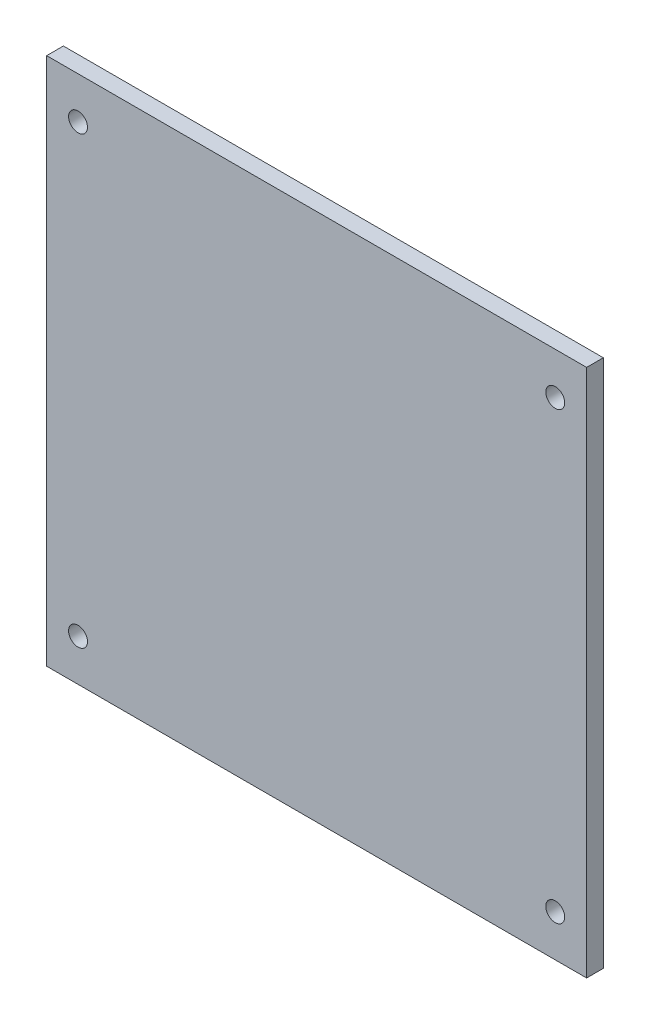
ISO-10303-21;
HEADER;
FILE_DESCRIPTION(('STEP AP214'),'2;1');
FILE_NAME('part.step','',(''),(''),'','','');
FILE_SCHEMA(('AUTOMOTIVE_DESIGN { 1 0 10303 214 1 1 1 1 }'));
ENDSEC;
DATA;
#1=APPLICATION_CONTEXT('core data for automotive mechanical design processes');
#2=APPLICATION_PROTOCOL_DEFINITION('international standard','automotive_design',2000,#1);
#3=PRODUCT_CONTEXT('',#1,'mechanical');
#4=PRODUCT('Part','Part','',(#3));
#5=PRODUCT_RELATED_PRODUCT_CATEGORY('part','',(#4));
#6=PRODUCT_DEFINITION_FORMATION('','',#4);
#7=PRODUCT_DEFINITION_CONTEXT('part definition',#1,'design');
#8=PRODUCT_DEFINITION('design','',#6,#7);
#9=PRODUCT_DEFINITION_SHAPE('','',#8);
#10=(LENGTH_UNIT() NAMED_UNIT(*) SI_UNIT(.MILLI.,.METRE.));
#11=(NAMED_UNIT(*) PLANE_ANGLE_UNIT() SI_UNIT($,.RADIAN.));
#12=(NAMED_UNIT(*) SI_UNIT($,.STERADIAN.) SOLID_ANGLE_UNIT());
#13=UNCERTAINTY_MEASURE_WITH_UNIT(LENGTH_MEASURE(1.E-05),#10,'distance_accuracy_value','');
#14=(GEOMETRIC_REPRESENTATION_CONTEXT(3) GLOBAL_UNCERTAINTY_ASSIGNED_CONTEXT((#13)) GLOBAL_UNIT_ASSIGNED_CONTEXT((#10,
#11,#12)) REPRESENTATION_CONTEXT('',''));
#15=CARTESIAN_POINT('',(0.,0.,0.));
#16=DIRECTION('',(0.,0.,1.));
#17=DIRECTION('',(1.,0.,0.));
#18=AXIS2_PLACEMENT_3D('',#15,#16,#17);
#19=CARTESIAN_POINT('',(0.,0.,3.));
#20=DIRECTION('',(1.,0.,0.));
#21=DIRECTION('',(0.,0.,-1.));
#22=AXIS2_PLACEMENT_3D('',#19,#20,#21);
#23=PLANE('',#22);
#24=DIRECTION('',(0.,-1.,0.));
#25=VECTOR('',#24,1.);
#26=CARTESIAN_POINT('',(0.,0.,0.));
#27=LINE('',#26,#25);
#28=CARTESIAN_POINT('',(0.,95.,0.));
#29=VERTEX_POINT('',#28);
#30=CARTESIAN_POINT('',(0.,0.,0.));
#31=VERTEX_POINT('',#30);
#32=EDGE_CURVE('E107',#29,#31,#27,.T.);
#33=ORIENTED_EDGE('',*,*,#32,.T.);
#34=DIRECTION('',(0.,0.,-1.));
#35=VECTOR('',#34,1.);
#36=CARTESIAN_POINT('',(0.,0.,3.));
#37=LINE('',#36,#35);
#38=CARTESIAN_POINT('',(0.,0.,3.));
#39=VERTEX_POINT('',#38);
#40=EDGE_CURVE('E11',#39,#31,#37,.T.);
#41=ORIENTED_EDGE('',*,*,#40,.F.);
#42=DIRECTION('',(0.,-1.,0.));
#43=VECTOR('',#42,1.);
#44=CARTESIAN_POINT('',(0.,0.,3.));
#45=LINE('',#44,#43);
#46=CARTESIAN_POINT('',(0.,95.,3.));
#47=VERTEX_POINT('',#46);
#48=EDGE_CURVE('E94',#47,#39,#45,.T.);
#49=ORIENTED_EDGE('',*,*,#48,.F.);
#50=DIRECTION('',(0.,0.,-1.));
#51=VECTOR('',#50,1.);
#52=CARTESIAN_POINT('',(0.,95.,3.));
#53=LINE('',#52,#51);
#54=EDGE_CURVE('E103',#47,#29,#53,.T.);
#55=ORIENTED_EDGE('',*,*,#54,.T.);
#56=EDGE_LOOP('',(#33,#41,#49,#55));
#57=FACE_BOUND('',#56,.T.);
#58=ADVANCED_FACE('F41',(#57),#23,.F.);
#59=CARTESIAN_POINT('',(0.,0.,3.));
#60=DIRECTION('',(0.,1.,0.));
#61=DIRECTION('',(0.,0.,1.));
#62=AXIS2_PLACEMENT_3D('',#59,#60,#61);
#63=PLANE('',#62);
#64=DIRECTION('',(1.,0.,0.));
#65=VECTOR('',#64,1.);
#66=CARTESIAN_POINT('',(0.,0.,0.));
#67=LINE('',#66,#65);
#68=CARTESIAN_POINT('',(97.,0.,0.));
#69=VERTEX_POINT('',#68);
#70=EDGE_CURVE('E98',#31,#69,#67,.T.);
#71=ORIENTED_EDGE('',*,*,#70,.T.);
#72=DIRECTION('',(0.,0.,-1.));
#73=VECTOR('',#72,1.);
#74=CARTESIAN_POINT('',(97.,0.,3.));
#75=LINE('',#74,#73);
#76=CARTESIAN_POINT('',(97.,0.,3.));
#77=VERTEX_POINT('',#76);
#78=EDGE_CURVE('E50',#77,#69,#75,.T.);
#79=ORIENTED_EDGE('',*,*,#78,.F.);
#80=DIRECTION('',(1.,0.,0.));
#81=VECTOR('',#80,1.);
#82=CARTESIAN_POINT('',(0.,0.,3.));
#83=LINE('',#82,#81);
#84=EDGE_CURVE('E89',#39,#77,#83,.T.);
#85=ORIENTED_EDGE('',*,*,#84,.F.);
#86=ORIENTED_EDGE('',*,*,#40,.T.);
#87=EDGE_LOOP('',(#71,#79,#85,#86));
#88=FACE_BOUND('',#87,.T.);
#89=ADVANCED_FACE('F97',(#88),#63,.F.);
#90=CARTESIAN_POINT('',(97.,0.,3.));
#91=DIRECTION('',(-1.,0.,0.));
#92=DIRECTION('',(0.,0.,1.));
#93=AXIS2_PLACEMENT_3D('',#90,#91,#92);
#94=PLANE('',#93);
#95=DIRECTION('',(0.,1.,0.));
#96=VECTOR('',#95,1.);
#97=CARTESIAN_POINT('',(97.,0.,0.));
#98=LINE('',#97,#96);
#99=CARTESIAN_POINT('',(97.,95.,0.));
#100=VERTEX_POINT('',#99);
#101=EDGE_CURVE('E76',#69,#100,#98,.T.);
#102=ORIENTED_EDGE('',*,*,#101,.T.);
#103=DIRECTION('',(0.,0.,-1.));
#104=VECTOR('',#103,1.);
#105=CARTESIAN_POINT('',(97.,95.,3.));
#106=LINE('',#105,#104);
#107=CARTESIAN_POINT('',(97.,95.,3.));
#108=VERTEX_POINT('',#107);
#109=EDGE_CURVE('E99',#108,#100,#106,.T.);
#110=ORIENTED_EDGE('',*,*,#109,.F.);
#111=DIRECTION('',(0.,1.,0.));
#112=VECTOR('',#111,1.);
#113=CARTESIAN_POINT('',(97.,0.,3.));
#114=LINE('',#113,#112);
#115=EDGE_CURVE('E92',#77,#108,#114,.T.);
#116=ORIENTED_EDGE('',*,*,#115,.F.);
#117=ORIENTED_EDGE('',*,*,#78,.T.);
#118=EDGE_LOOP('',(#102,#110,#116,#117));
#119=FACE_BOUND('',#118,.T.);
#120=ADVANCED_FACE('F101',(#119),#94,.F.);
#121=CARTESIAN_POINT('',(0.,95.,3.));
#122=DIRECTION('',(0.,-1.,0.));
#123=DIRECTION('',(0.,0.,-1.));
#124=AXIS2_PLACEMENT_3D('',#121,#122,#123);
#125=PLANE('',#124);
#126=DIRECTION('',(-1.,0.,0.));
#127=VECTOR('',#126,1.);
#128=CARTESIAN_POINT('',(0.,95.,0.));
#129=LINE('',#128,#127);
#130=EDGE_CURVE('E82',#100,#29,#129,.T.);
#131=ORIENTED_EDGE('',*,*,#130,.T.);
#132=ORIENTED_EDGE('',*,*,#54,.F.);
#133=DIRECTION('',(-1.,0.,0.));
#134=VECTOR('',#133,1.);
#135=CARTESIAN_POINT('',(0.,95.,3.));
#136=LINE('',#135,#134);
#137=EDGE_CURVE('E59',#108,#47,#136,.T.);
#138=ORIENTED_EDGE('',*,*,#137,.F.);
#139=ORIENTED_EDGE('',*,*,#109,.T.);
#140=EDGE_LOOP('',(#131,#132,#138,#139));
#141=FACE_BOUND('',#140,.T.);
#142=ADVANCED_FACE('F143',(#141),#125,.F.);
#143=CARTESIAN_POINT('',(0.,0.,3.));
#144=DIRECTION('',(0.,0.,-1.));
#145=DIRECTION('',(-1.,0.,0.));
#146=AXIS2_PLACEMENT_3D('',#143,#144,#145);
#147=PLANE('',#146);
#148=CARTESIAN_POINT('',(91.365,7.495,3.));
#149=DIRECTION('',(0.,0.,1.));
#150=DIRECTION('',(1.,0.,0.));
#151=AXIS2_PLACEMENT_3D('',#148,#149,#150);
#152=CIRCLE('',#151,1.69999999999999);
#153=CARTESIAN_POINT('',(93.065,7.495,3.));
#154=VERTEX_POINT('',#153);
#155=EDGE_CURVE('E225',#154,#154,#152,.T.);
#156=ORIENTED_EDGE('',*,*,#155,.F.);
#157=EDGE_LOOP('',(#156));
#158=FACE_BOUND('',#157,.T.);
#159=CARTESIAN_POINT('',(5.635,87.505,3.));
#160=DIRECTION('',(0.,0.,1.));
#161=DIRECTION('',(1.,0.,0.));
#162=AXIS2_PLACEMENT_3D('',#159,#160,#161);
#163=CIRCLE('',#162,1.7);
#164=CARTESIAN_POINT('',(7.335,87.505,3.));
#165=VERTEX_POINT('',#164);
#166=EDGE_CURVE('E223',#165,#165,#163,.T.);
#167=ORIENTED_EDGE('',*,*,#166,.F.);
#168=EDGE_LOOP('',(#167));
#169=FACE_BOUND('',#168,.T.);
#170=CARTESIAN_POINT('',(91.365,87.505,3.));
#171=DIRECTION('',(0.,0.,1.));
#172=DIRECTION('',(1.,0.,0.));
#173=AXIS2_PLACEMENT_3D('',#170,#171,#172);
#174=CIRCLE('',#173,1.69999999999999);
#175=CARTESIAN_POINT('',(93.065,87.505,3.));
#176=VERTEX_POINT('',#175);
#177=EDGE_CURVE('E226',#176,#176,#174,.T.);
#178=ORIENTED_EDGE('',*,*,#177,.F.);
#179=EDGE_LOOP('',(#178));
#180=FACE_BOUND('',#179,.T.);
#181=CARTESIAN_POINT('',(5.635,7.495,3.));
#182=DIRECTION('',(0.,0.,1.));
#183=DIRECTION('',(1.,0.,0.));
#184=AXIS2_PLACEMENT_3D('',#181,#182,#183);
#185=CIRCLE('',#184,1.7);
#186=CARTESIAN_POINT('',(7.335,7.495,3.));
#187=VERTEX_POINT('',#186);
#188=EDGE_CURVE('E119',#187,#187,#185,.T.);
#189=ORIENTED_EDGE('',*,*,#188,.F.);
#190=EDGE_LOOP('',(#189));
#191=FACE_BOUND('',#190,.T.);
#192=ORIENTED_EDGE('',*,*,#48,.T.);
#193=ORIENTED_EDGE('',*,*,#84,.T.);
#194=ORIENTED_EDGE('',*,*,#115,.T.);
#195=ORIENTED_EDGE('',*,*,#137,.T.);
#196=EDGE_LOOP('',(#192,#193,#194,#195));
#197=FACE_BOUND('',#196,.T.);
#198=ADVANCED_FACE('F90',(#158,#169,#180,#191,#197),#147,.F.);
#199=CARTESIAN_POINT('',(0.,0.,0.));
#200=DIRECTION('',(0.,0.,-1.));
#201=DIRECTION('',(-1.,0.,0.));
#202=AXIS2_PLACEMENT_3D('',#199,#200,#201);
#203=PLANE('',#202);
#204=CARTESIAN_POINT('',(91.365,7.495,0.));
#205=DIRECTION('',(0.,0.,-1.));
#206=DIRECTION('',(-1.,0.,0.));
#207=AXIS2_PLACEMENT_3D('',#204,#205,#206);
#208=CIRCLE('',#207,1.69999999999999);
#209=CARTESIAN_POINT('',(93.065,7.495,0.));
#210=VERTEX_POINT('',#209);
#211=EDGE_CURVE('E44',#210,#210,#208,.T.);
#212=ORIENTED_EDGE('',*,*,#211,.F.);
#213=EDGE_LOOP('',(#212));
#214=FACE_BOUND('',#213,.T.);
#215=CARTESIAN_POINT('',(5.635,87.505,0.));
#216=DIRECTION('',(0.,0.,-1.));
#217=DIRECTION('',(-1.,0.,0.));
#218=AXIS2_PLACEMENT_3D('',#215,#216,#217);
#219=CIRCLE('',#218,1.7);
#220=CARTESIAN_POINT('',(7.335,87.505,0.));
#221=VERTEX_POINT('',#220);
#222=EDGE_CURVE('E121',#221,#221,#219,.T.);
#223=ORIENTED_EDGE('',*,*,#222,.F.);
#224=EDGE_LOOP('',(#223));
#225=FACE_BOUND('',#224,.T.);
#226=CARTESIAN_POINT('',(91.365,87.505,0.));
#227=DIRECTION('',(0.,0.,-1.));
#228=DIRECTION('',(-1.,0.,0.));
#229=AXIS2_PLACEMENT_3D('',#226,#227,#228);
#230=CIRCLE('',#229,1.69999999999999);
#231=CARTESIAN_POINT('',(93.065,87.505,0.));
#232=VERTEX_POINT('',#231);
#233=EDGE_CURVE('E118',#232,#232,#230,.T.);
#234=ORIENTED_EDGE('',*,*,#233,.F.);
#235=EDGE_LOOP('',(#234));
#236=FACE_BOUND('',#235,.T.);
#237=CARTESIAN_POINT('',(5.635,7.495,0.));
#238=DIRECTION('',(0.,0.,-1.));
#239=DIRECTION('',(-1.,0.,0.));
#240=AXIS2_PLACEMENT_3D('',#237,#238,#239);
#241=CIRCLE('',#240,1.7);
#242=CARTESIAN_POINT('',(7.335,7.495,0.));
#243=VERTEX_POINT('',#242);
#244=EDGE_CURVE('E115',#243,#243,#241,.T.);
#245=ORIENTED_EDGE('',*,*,#244,.F.);
#246=EDGE_LOOP('',(#245));
#247=FACE_BOUND('',#246,.T.);
#248=ORIENTED_EDGE('',*,*,#32,.F.);
#249=ORIENTED_EDGE('',*,*,#130,.F.);
#250=ORIENTED_EDGE('',*,*,#101,.F.);
#251=ORIENTED_EDGE('',*,*,#70,.F.);
#252=EDGE_LOOP('',(#248,#249,#250,#251));
#253=FACE_BOUND('',#252,.T.);
#254=ADVANCED_FACE('F131',(#214,#225,#236,#247,#253),#203,.T.);
#255=CARTESIAN_POINT('',(5.635,7.495,-1.2E-05));
#256=DIRECTION('',(0.,0.,1.));
#257=DIRECTION('',(1.,0.,0.));
#258=AXIS2_PLACEMENT_3D('',#255,#256,#257);
#259=CYLINDRICAL_SURFACE('',#258,1.7);
#260=CARTESIAN_POINT('',(7.335,7.495,0.));
#261=CARTESIAN_POINT('',(7.335,7.495,0.03125));
#262=CARTESIAN_POINT('',(7.335,7.495,0.0625));
#263=CARTESIAN_POINT('',(7.335,7.495,0.125));
#264=CARTESIAN_POINT('',(7.335,7.495,0.15625));
#265=CARTESIAN_POINT('',(7.335,7.495,0.21875));
#266=CARTESIAN_POINT('',(7.335,7.495,0.25));
#267=CARTESIAN_POINT('',(7.335,7.495,0.3125));
#268=CARTESIAN_POINT('',(7.335,7.495,0.34375));
#269=CARTESIAN_POINT('',(7.335,7.495,0.40625));
#270=CARTESIAN_POINT('',(7.335,7.495,0.4375));
#271=CARTESIAN_POINT('',(7.335,7.495,0.5));
#272=CARTESIAN_POINT('',(7.335,7.495,0.53125));
#273=CARTESIAN_POINT('',(7.335,7.495,0.59375));
#274=CARTESIAN_POINT('',(7.335,7.495,0.625));
#275=CARTESIAN_POINT('',(7.335,7.495,0.6875));
#276=CARTESIAN_POINT('',(7.335,7.495,0.71875));
#277=CARTESIAN_POINT('',(7.335,7.495,0.78125));
#278=CARTESIAN_POINT('',(7.335,7.495,0.8125));
#279=CARTESIAN_POINT('',(7.335,7.495,0.875));
#280=CARTESIAN_POINT('',(7.335,7.495,0.90625));
#281=CARTESIAN_POINT('',(7.335,7.495,0.96875));
#282=CARTESIAN_POINT('',(7.335,7.495,1.));
#283=CARTESIAN_POINT('',(7.335,7.495,1.0625));
#284=CARTESIAN_POINT('',(7.335,7.495,1.09375));
#285=CARTESIAN_POINT('',(7.335,7.495,1.15625));
#286=CARTESIAN_POINT('',(7.335,7.495,1.1875));
#287=CARTESIAN_POINT('',(7.335,7.495,1.25));
#288=CARTESIAN_POINT('',(7.335,7.495,1.28125));
#289=CARTESIAN_POINT('',(7.335,7.495,1.34375));
#290=CARTESIAN_POINT('',(7.335,7.495,1.375));
#291=CARTESIAN_POINT('',(7.335,7.495,1.4375));
#292=CARTESIAN_POINT('',(7.335,7.495,1.46875));
#293=CARTESIAN_POINT('',(7.335,7.495,1.53125));
#294=CARTESIAN_POINT('',(7.335,7.495,1.5625));
#295=CARTESIAN_POINT('',(7.335,7.495,1.625));
#296=CARTESIAN_POINT('',(7.335,7.495,1.65625));
#297=CARTESIAN_POINT('',(7.335,7.495,1.71875));
#298=CARTESIAN_POINT('',(7.335,7.495,1.75));
#299=CARTESIAN_POINT('',(7.335,7.495,1.8125));
#300=CARTESIAN_POINT('',(7.335,7.495,1.84375));
#301=CARTESIAN_POINT('',(7.335,7.495,1.90625));
#302=CARTESIAN_POINT('',(7.335,7.495,1.9375));
#303=CARTESIAN_POINT('',(7.335,7.495,2.));
#304=CARTESIAN_POINT('',(7.335,7.495,2.03125));
#305=CARTESIAN_POINT('',(7.335,7.495,2.09375));
#306=CARTESIAN_POINT('',(7.335,7.495,2.125));
#307=CARTESIAN_POINT('',(7.335,7.495,2.1875));
#308=CARTESIAN_POINT('',(7.335,7.495,2.21875));
#309=CARTESIAN_POINT('',(7.335,7.495,2.28125));
#310=CARTESIAN_POINT('',(7.335,7.495,2.3125));
#311=CARTESIAN_POINT('',(7.335,7.495,2.375));
#312=CARTESIAN_POINT('',(7.335,7.495,2.40625));
#313=CARTESIAN_POINT('',(7.335,7.495,2.46875));
#314=CARTESIAN_POINT('',(7.335,7.495,2.5));
#315=CARTESIAN_POINT('',(7.335,7.495,2.5625));
#316=CARTESIAN_POINT('',(7.335,7.495,2.59375));
#317=CARTESIAN_POINT('',(7.335,7.495,2.65625));
#318=CARTESIAN_POINT('',(7.335,7.495,2.6875));
#319=CARTESIAN_POINT('',(7.335,7.495,2.75));
#320=CARTESIAN_POINT('',(7.335,7.495,2.78125));
#321=CARTESIAN_POINT('',(7.335,7.495,2.84375));
#322=CARTESIAN_POINT('',(7.335,7.495,2.875));
#323=CARTESIAN_POINT('',(7.335,7.495,2.9375));
#324=CARTESIAN_POINT('',(7.335,7.495,2.96875));
#325=CARTESIAN_POINT('',(7.335,7.495,3.));
#326=B_SPLINE_CURVE_WITH_KNOTS('',3,(#260,#261,#262,#263,#264,#265,#266,#267,#268,#269,#270,
#271,#272,#273,#274,#275,#276,#277,#278,#279,#280,#281,#282,#283,#284,#285,#286,#287,#288,#289,
#290,#291,#292,#293,#294,#295,#296,#297,#298,#299,#300,#301,#302,#303,#304,#305,#306,#307,#308,
#309,#310,#311,#312,#313,#314,#315,#316,#317,#318,#319,#320,#321,#322,#323,#324,#325),
.UNSPECIFIED.,.F.,.F.,(4,2,2,2,2,2,2,2,2,2,2,2,2,2,2,2,2,2,2,2,2,2,2,2,2,2,2,2,2,2,2,2,4),(0.,
0.09375,0.1875,0.28125,0.375,0.46875,0.5625,0.65625,0.75,0.84375,0.9375,1.03125,1.125,1.21875,
1.3125,1.40625,1.5,1.59375,1.6875,1.78125,1.875,1.96875,2.0625,2.15625,2.25,2.34375,2.4375,
2.53125,2.625,2.71875,2.8125,2.90625,3.),.UNSPECIFIED.);
#327=EDGE_CURVE('BSEAM134',#243,#187,#326,.T.);
#328=ORIENTED_EDGE('',*,*,#244,.T.);
#329=ORIENTED_EDGE('',*,*,#188,.T.);
#330=ORIENTED_EDGE('',*,*,#327,.T.);
#331=ORIENTED_EDGE('',*,*,#327,.F.);
#332=EDGE_LOOP('',(#328,#330,#329,#331));
#333=FACE_BOUND('',#332,.T.);
#334=ADVANCED_FACE('F134',(#333),#259,.F.);
#335=CARTESIAN_POINT('',(91.365,87.505,-1.2E-05));
#336=DIRECTION('',(0.,0.,1.));
#337=DIRECTION('',(1.,0.,0.));
#338=AXIS2_PLACEMENT_3D('',#335,#336,#337);
#339=CYLINDRICAL_SURFACE('',#338,1.69999999999999);
#340=CARTESIAN_POINT('',(93.065,87.505,0.));
#341=CARTESIAN_POINT('',(93.065,87.505,0.03125));
#342=CARTESIAN_POINT('',(93.065,87.505,0.0625));
#343=CARTESIAN_POINT('',(93.065,87.505,0.125));
#344=CARTESIAN_POINT('',(93.065,87.505,0.15625));
#345=CARTESIAN_POINT('',(93.065,87.505,0.21875));
#346=CARTESIAN_POINT('',(93.065,87.505,0.25));
#347=CARTESIAN_POINT('',(93.065,87.505,0.3125));
#348=CARTESIAN_POINT('',(93.065,87.505,0.34375));
#349=CARTESIAN_POINT('',(93.065,87.505,0.40625));
#350=CARTESIAN_POINT('',(93.065,87.505,0.4375));
#351=CARTESIAN_POINT('',(93.065,87.505,0.5));
#352=CARTESIAN_POINT('',(93.065,87.505,0.53125));
#353=CARTESIAN_POINT('',(93.065,87.505,0.59375));
#354=CARTESIAN_POINT('',(93.065,87.505,0.625));
#355=CARTESIAN_POINT('',(93.065,87.505,0.6875));
#356=CARTESIAN_POINT('',(93.065,87.505,0.71875));
#357=CARTESIAN_POINT('',(93.065,87.505,0.78125));
#358=CARTESIAN_POINT('',(93.065,87.505,0.8125));
#359=CARTESIAN_POINT('',(93.065,87.505,0.875));
#360=CARTESIAN_POINT('',(93.065,87.505,0.90625));
#361=CARTESIAN_POINT('',(93.065,87.505,0.96875));
#362=CARTESIAN_POINT('',(93.065,87.505,1.));
#363=CARTESIAN_POINT('',(93.065,87.505,1.0625));
#364=CARTESIAN_POINT('',(93.065,87.505,1.09375));
#365=CARTESIAN_POINT('',(93.065,87.505,1.15625));
#366=CARTESIAN_POINT('',(93.065,87.505,1.1875));
#367=CARTESIAN_POINT('',(93.065,87.505,1.25));
#368=CARTESIAN_POINT('',(93.065,87.505,1.28125));
#369=CARTESIAN_POINT('',(93.065,87.505,1.34375));
#370=CARTESIAN_POINT('',(93.065,87.505,1.375));
#371=CARTESIAN_POINT('',(93.065,87.505,1.4375));
#372=CARTESIAN_POINT('',(93.065,87.505,1.46875));
#373=CARTESIAN_POINT('',(93.065,87.505,1.53125));
#374=CARTESIAN_POINT('',(93.065,87.505,1.5625));
#375=CARTESIAN_POINT('',(93.065,87.505,1.625));
#376=CARTESIAN_POINT('',(93.065,87.505,1.65625));
#377=CARTESIAN_POINT('',(93.065,87.505,1.71875));
#378=CARTESIAN_POINT('',(93.065,87.505,1.75));
#379=CARTESIAN_POINT('',(93.065,87.505,1.8125));
#380=CARTESIAN_POINT('',(93.065,87.505,1.84375));
#381=CARTESIAN_POINT('',(93.065,87.505,1.90625));
#382=CARTESIAN_POINT('',(93.065,87.505,1.9375));
#383=CARTESIAN_POINT('',(93.065,87.505,2.));
#384=CARTESIAN_POINT('',(93.065,87.505,2.03125));
#385=CARTESIAN_POINT('',(93.065,87.505,2.09375));
#386=CARTESIAN_POINT('',(93.065,87.505,2.125));
#387=CARTESIAN_POINT('',(93.065,87.505,2.1875));
#388=CARTESIAN_POINT('',(93.065,87.505,2.21875));
#389=CARTESIAN_POINT('',(93.065,87.505,2.28125));
#390=CARTESIAN_POINT('',(93.065,87.505,2.3125));
#391=CARTESIAN_POINT('',(93.065,87.505,2.375));
#392=CARTESIAN_POINT('',(93.065,87.505,2.40625));
#393=CARTESIAN_POINT('',(93.065,87.505,2.46875));
#394=CARTESIAN_POINT('',(93.065,87.505,2.5));
#395=CARTESIAN_POINT('',(93.065,87.505,2.5625));
#396=CARTESIAN_POINT('',(93.065,87.505,2.59375));
#397=CARTESIAN_POINT('',(93.065,87.505,2.65625));
#398=CARTESIAN_POINT('',(93.065,87.505,2.6875));
#399=CARTESIAN_POINT('',(93.065,87.505,2.75));
#400=CARTESIAN_POINT('',(93.065,87.505,2.78125));
#401=CARTESIAN_POINT('',(93.065,87.505,2.84375));
#402=CARTESIAN_POINT('',(93.065,87.505,2.875));
#403=CARTESIAN_POINT('',(93.065,87.505,2.9375));
#404=CARTESIAN_POINT('',(93.065,87.505,2.96875));
#405=CARTESIAN_POINT('',(93.065,87.505,3.));
#406=B_SPLINE_CURVE_WITH_KNOTS('',3,(#340,#341,#342,#343,#344,#345,#346,#347,#348,#349,#350,
#351,#352,#353,#354,#355,#356,#357,#358,#359,#360,#361,#362,#363,#364,#365,#366,#367,#368,#369,
#370,#371,#372,#373,#374,#375,#376,#377,#378,#379,#380,#381,#382,#383,#384,#385,#386,#387,#388,
#389,#390,#391,#392,#393,#394,#395,#396,#397,#398,#399,#400,#401,#402,#403,#404,#405),
.UNSPECIFIED.,.F.,.F.,(4,2,2,2,2,2,2,2,2,2,2,2,2,2,2,2,2,2,2,2,2,2,2,2,2,2,2,2,2,2,2,2,4),(0.,
0.09375,0.1875,0.28125,0.375,0.46875,0.5625,0.65625,0.75,0.84375,0.9375,1.03125,1.125,1.21875,
1.3125,1.40625,1.5,1.59375,1.6875,1.78125,1.875,1.96875,2.0625,2.15625,2.25,2.34375,2.4375,
2.53125,2.625,2.71875,2.8125,2.90625,3.),.UNSPECIFIED.);
#407=EDGE_CURVE('BSEAM190',#232,#176,#406,.T.);
#408=ORIENTED_EDGE('',*,*,#233,.T.);
#409=ORIENTED_EDGE('',*,*,#177,.T.);
#410=ORIENTED_EDGE('',*,*,#407,.T.);
#411=ORIENTED_EDGE('',*,*,#407,.F.);
#412=EDGE_LOOP('',(#408,#410,#409,#411));
#413=FACE_BOUND('',#412,.T.);
#414=ADVANCED_FACE('F190',(#413),#339,.F.);
#415=CARTESIAN_POINT('',(5.635,87.505,-1.2E-05));
#416=DIRECTION('',(0.,0.,1.));
#417=DIRECTION('',(1.,0.,0.));
#418=AXIS2_PLACEMENT_3D('',#415,#416,#417);
#419=CYLINDRICAL_SURFACE('',#418,1.7);
#420=CARTESIAN_POINT('',(7.335,87.505,0.));
#421=CARTESIAN_POINT('',(7.335,87.505,0.03125));
#422=CARTESIAN_POINT('',(7.335,87.505,0.0625));
#423=CARTESIAN_POINT('',(7.335,87.505,0.125));
#424=CARTESIAN_POINT('',(7.335,87.505,0.15625));
#425=CARTESIAN_POINT('',(7.335,87.505,0.21875));
#426=CARTESIAN_POINT('',(7.335,87.505,0.25));
#427=CARTESIAN_POINT('',(7.335,87.505,0.3125));
#428=CARTESIAN_POINT('',(7.335,87.505,0.34375));
#429=CARTESIAN_POINT('',(7.335,87.505,0.40625));
#430=CARTESIAN_POINT('',(7.335,87.505,0.4375));
#431=CARTESIAN_POINT('',(7.335,87.505,0.5));
#432=CARTESIAN_POINT('',(7.335,87.505,0.53125));
#433=CARTESIAN_POINT('',(7.335,87.505,0.59375));
#434=CARTESIAN_POINT('',(7.335,87.505,0.625));
#435=CARTESIAN_POINT('',(7.335,87.505,0.6875));
#436=CARTESIAN_POINT('',(7.335,87.505,0.71875));
#437=CARTESIAN_POINT('',(7.335,87.505,0.78125));
#438=CARTESIAN_POINT('',(7.335,87.505,0.8125));
#439=CARTESIAN_POINT('',(7.335,87.505,0.875));
#440=CARTESIAN_POINT('',(7.335,87.505,0.90625));
#441=CARTESIAN_POINT('',(7.335,87.505,0.96875));
#442=CARTESIAN_POINT('',(7.335,87.505,1.));
#443=CARTESIAN_POINT('',(7.335,87.505,1.0625));
#444=CARTESIAN_POINT('',(7.335,87.505,1.09375));
#445=CARTESIAN_POINT('',(7.335,87.505,1.15625));
#446=CARTESIAN_POINT('',(7.335,87.505,1.1875));
#447=CARTESIAN_POINT('',(7.335,87.505,1.25));
#448=CARTESIAN_POINT('',(7.335,87.505,1.28125));
#449=CARTESIAN_POINT('',(7.335,87.505,1.34375));
#450=CARTESIAN_POINT('',(7.335,87.505,1.375));
#451=CARTESIAN_POINT('',(7.335,87.505,1.4375));
#452=CARTESIAN_POINT('',(7.335,87.505,1.46875));
#453=CARTESIAN_POINT('',(7.335,87.505,1.53125));
#454=CARTESIAN_POINT('',(7.335,87.505,1.5625));
#455=CARTESIAN_POINT('',(7.335,87.505,1.625));
#456=CARTESIAN_POINT('',(7.335,87.505,1.65625));
#457=CARTESIAN_POINT('',(7.335,87.505,1.71875));
#458=CARTESIAN_POINT('',(7.335,87.505,1.75));
#459=CARTESIAN_POINT('',(7.335,87.505,1.8125));
#460=CARTESIAN_POINT('',(7.335,87.505,1.84375));
#461=CARTESIAN_POINT('',(7.335,87.505,1.90625));
#462=CARTESIAN_POINT('',(7.335,87.505,1.9375));
#463=CARTESIAN_POINT('',(7.335,87.505,2.));
#464=CARTESIAN_POINT('',(7.335,87.505,2.03125));
#465=CARTESIAN_POINT('',(7.335,87.505,2.09375));
#466=CARTESIAN_POINT('',(7.335,87.505,2.125));
#467=CARTESIAN_POINT('',(7.335,87.505,2.1875));
#468=CARTESIAN_POINT('',(7.335,87.505,2.21875));
#469=CARTESIAN_POINT('',(7.335,87.505,2.28125));
#470=CARTESIAN_POINT('',(7.335,87.505,2.3125));
#471=CARTESIAN_POINT('',(7.335,87.505,2.375));
#472=CARTESIAN_POINT('',(7.335,87.505,2.40625));
#473=CARTESIAN_POINT('',(7.335,87.505,2.46875));
#474=CARTESIAN_POINT('',(7.335,87.505,2.5));
#475=CARTESIAN_POINT('',(7.335,87.505,2.5625));
#476=CARTESIAN_POINT('',(7.335,87.505,2.59375));
#477=CARTESIAN_POINT('',(7.335,87.505,2.65625));
#478=CARTESIAN_POINT('',(7.335,87.505,2.6875));
#479=CARTESIAN_POINT('',(7.335,87.505,2.75));
#480=CARTESIAN_POINT('',(7.335,87.505,2.78125));
#481=CARTESIAN_POINT('',(7.335,87.505,2.84375));
#482=CARTESIAN_POINT('',(7.335,87.505,2.875));
#483=CARTESIAN_POINT('',(7.335,87.505,2.9375));
#484=CARTESIAN_POINT('',(7.335,87.505,2.96875));
#485=CARTESIAN_POINT('',(7.335,87.505,3.));
#486=B_SPLINE_CURVE_WITH_KNOTS('',3,(#420,#421,#422,#423,#424,#425,#426,#427,#428,#429,#430,
#431,#432,#433,#434,#435,#436,#437,#438,#439,#440,#441,#442,#443,#444,#445,#446,#447,#448,#449,
#450,#451,#452,#453,#454,#455,#456,#457,#458,#459,#460,#461,#462,#463,#464,#465,#466,#467,#468,
#469,#470,#471,#472,#473,#474,#475,#476,#477,#478,#479,#480,#481,#482,#483,#484,#485),
.UNSPECIFIED.,.F.,.F.,(4,2,2,2,2,2,2,2,2,2,2,2,2,2,2,2,2,2,2,2,2,2,2,2,2,2,2,2,2,2,2,2,4),(0.,
0.09375,0.1875,0.28125,0.375,0.46875,0.5625,0.65625,0.75,0.84375,0.9375,1.03125,1.125,1.21875,
1.3125,1.40625,1.5,1.59375,1.6875,1.78125,1.875,1.96875,2.0625,2.15625,2.25,2.34375,2.4375,
2.53125,2.625,2.71875,2.8125,2.90625,3.),.UNSPECIFIED.);
#487=EDGE_CURVE('BSEAM200',#221,#165,#486,.T.);
#488=ORIENTED_EDGE('',*,*,#222,.T.);
#489=ORIENTED_EDGE('',*,*,#166,.T.);
#490=ORIENTED_EDGE('',*,*,#487,.T.);
#491=ORIENTED_EDGE('',*,*,#487,.F.);
#492=EDGE_LOOP('',(#488,#490,#489,#491));
#493=FACE_BOUND('',#492,.T.);
#494=ADVANCED_FACE('F200',(#493),#419,.F.);
#495=CARTESIAN_POINT('',(91.365,7.495,-1.2E-05));
#496=DIRECTION('',(0.,0.,1.));
#497=DIRECTION('',(1.,0.,0.));
#498=AXIS2_PLACEMENT_3D('',#495,#496,#497);
#499=CYLINDRICAL_SURFACE('',#498,1.69999999999999);
#500=CARTESIAN_POINT('',(93.065,7.495,0.));
#501=CARTESIAN_POINT('',(93.065,7.495,0.03125));
#502=CARTESIAN_POINT('',(93.065,7.495,0.0625));
#503=CARTESIAN_POINT('',(93.065,7.495,0.125));
#504=CARTESIAN_POINT('',(93.065,7.495,0.15625));
#505=CARTESIAN_POINT('',(93.065,7.495,0.21875));
#506=CARTESIAN_POINT('',(93.065,7.495,0.25));
#507=CARTESIAN_POINT('',(93.065,7.495,0.3125));
#508=CARTESIAN_POINT('',(93.065,7.495,0.34375));
#509=CARTESIAN_POINT('',(93.065,7.495,0.40625));
#510=CARTESIAN_POINT('',(93.065,7.495,0.4375));
#511=CARTESIAN_POINT('',(93.065,7.495,0.5));
#512=CARTESIAN_POINT('',(93.065,7.495,0.53125));
#513=CARTESIAN_POINT('',(93.065,7.495,0.59375));
#514=CARTESIAN_POINT('',(93.065,7.495,0.625));
#515=CARTESIAN_POINT('',(93.065,7.495,0.6875));
#516=CARTESIAN_POINT('',(93.065,7.495,0.71875));
#517=CARTESIAN_POINT('',(93.065,7.495,0.78125));
#518=CARTESIAN_POINT('',(93.065,7.495,0.8125));
#519=CARTESIAN_POINT('',(93.065,7.495,0.875));
#520=CARTESIAN_POINT('',(93.065,7.495,0.90625));
#521=CARTESIAN_POINT('',(93.065,7.495,0.96875));
#522=CARTESIAN_POINT('',(93.065,7.495,1.));
#523=CARTESIAN_POINT('',(93.065,7.495,1.0625));
#524=CARTESIAN_POINT('',(93.065,7.495,1.09375));
#525=CARTESIAN_POINT('',(93.065,7.495,1.15625));
#526=CARTESIAN_POINT('',(93.065,7.495,1.1875));
#527=CARTESIAN_POINT('',(93.065,7.495,1.25));
#528=CARTESIAN_POINT('',(93.065,7.495,1.28125));
#529=CARTESIAN_POINT('',(93.065,7.495,1.34375));
#530=CARTESIAN_POINT('',(93.065,7.495,1.375));
#531=CARTESIAN_POINT('',(93.065,7.495,1.4375));
#532=CARTESIAN_POINT('',(93.065,7.495,1.46875));
#533=CARTESIAN_POINT('',(93.065,7.495,1.53125));
#534=CARTESIAN_POINT('',(93.065,7.495,1.5625));
#535=CARTESIAN_POINT('',(93.065,7.495,1.625));
#536=CARTESIAN_POINT('',(93.065,7.495,1.65625));
#537=CARTESIAN_POINT('',(93.065,7.495,1.71875));
#538=CARTESIAN_POINT('',(93.065,7.495,1.75));
#539=CARTESIAN_POINT('',(93.065,7.495,1.8125));
#540=CARTESIAN_POINT('',(93.065,7.495,1.84375));
#541=CARTESIAN_POINT('',(93.065,7.495,1.90625));
#542=CARTESIAN_POINT('',(93.065,7.495,1.9375));
#543=CARTESIAN_POINT('',(93.065,7.495,2.));
#544=CARTESIAN_POINT('',(93.065,7.495,2.03125));
#545=CARTESIAN_POINT('',(93.065,7.495,2.09375));
#546=CARTESIAN_POINT('',(93.065,7.495,2.125));
#547=CARTESIAN_POINT('',(93.065,7.495,2.1875));
#548=CARTESIAN_POINT('',(93.065,7.495,2.21875));
#549=CARTESIAN_POINT('',(93.065,7.495,2.28125));
#550=CARTESIAN_POINT('',(93.065,7.495,2.3125));
#551=CARTESIAN_POINT('',(93.065,7.495,2.375));
#552=CARTESIAN_POINT('',(93.065,7.495,2.40625));
#553=CARTESIAN_POINT('',(93.065,7.495,2.46875));
#554=CARTESIAN_POINT('',(93.065,7.495,2.5));
#555=CARTESIAN_POINT('',(93.065,7.495,2.5625));
#556=CARTESIAN_POINT('',(93.065,7.495,2.59375));
#557=CARTESIAN_POINT('',(93.065,7.495,2.65625));
#558=CARTESIAN_POINT('',(93.065,7.495,2.6875));
#559=CARTESIAN_POINT('',(93.065,7.495,2.75));
#560=CARTESIAN_POINT('',(93.065,7.495,2.78125));
#561=CARTESIAN_POINT('',(93.065,7.495,2.84375));
#562=CARTESIAN_POINT('',(93.065,7.495,2.875));
#563=CARTESIAN_POINT('',(93.065,7.495,2.9375));
#564=CARTESIAN_POINT('',(93.065,7.495,2.96875));
#565=CARTESIAN_POINT('',(93.065,7.495,3.));
#566=B_SPLINE_CURVE_WITH_KNOTS('',3,(#500,#501,#502,#503,#504,#505,#506,#507,#508,#509,#510,
#511,#512,#513,#514,#515,#516,#517,#518,#519,#520,#521,#522,#523,#524,#525,#526,#527,#528,#529,
#530,#531,#532,#533,#534,#535,#536,#537,#538,#539,#540,#541,#542,#543,#544,#545,#546,#547,#548,
#549,#550,#551,#552,#553,#554,#555,#556,#557,#558,#559,#560,#561,#562,#563,#564,#565),
.UNSPECIFIED.,.F.,.F.,(4,2,2,2,2,2,2,2,2,2,2,2,2,2,2,2,2,2,2,2,2,2,2,2,2,2,2,2,2,2,2,2,4),(0.,
0.09375,0.1875,0.28125,0.375,0.46875,0.5625,0.65625,0.75,0.84375,0.9375,1.03125,1.125,1.21875,
1.3125,1.40625,1.5,1.59375,1.6875,1.78125,1.875,1.96875,2.0625,2.15625,2.25,2.34375,2.4375,
2.53125,2.625,2.71875,2.8125,2.90625,3.),.UNSPECIFIED.);
#567=EDGE_CURVE('BSEAM128',#210,#154,#566,.T.);
#568=ORIENTED_EDGE('',*,*,#211,.T.);
#569=ORIENTED_EDGE('',*,*,#155,.T.);
#570=ORIENTED_EDGE('',*,*,#567,.T.);
#571=ORIENTED_EDGE('',*,*,#567,.F.);
#572=EDGE_LOOP('',(#568,#570,#569,#571));
#573=FACE_BOUND('',#572,.T.);
#574=ADVANCED_FACE('F128',(#573),#499,.F.);
#575=CLOSED_SHELL('',(#58,#89,#120,#142,#198,#254,#334,#414,#494,#574));
#576=MANIFOLD_SOLID_BREP('B2',#575);
#577=ADVANCED_BREP_SHAPE_REPRESENTATION('',(#18,#576),#14);
#578=SHAPE_DEFINITION_REPRESENTATION(#9,#577);
ENDSEC;
END-ISO-10303-21;
